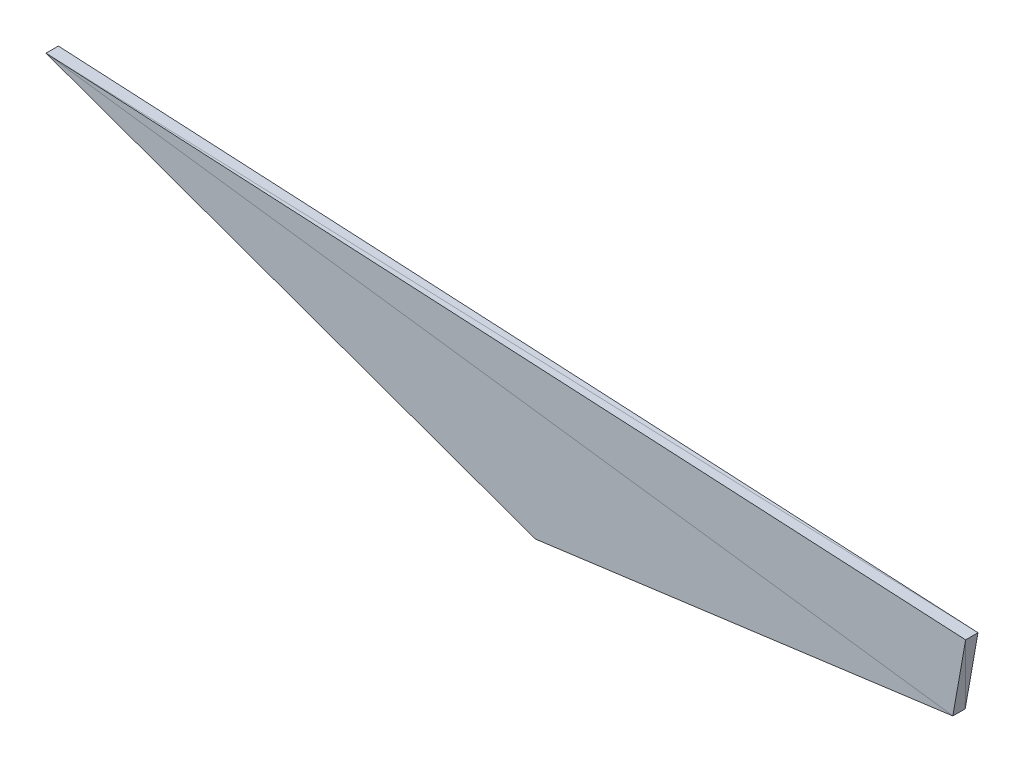
ISO-10303-21;
HEADER;
FILE_DESCRIPTION(('STEP AP214'),'2;1');
FILE_NAME('part.step','',(''),(''),'','','');
FILE_SCHEMA(('AUTOMOTIVE_DESIGN { 1 0 10303 214 1 1 1 1 }'));
ENDSEC;
DATA;
#1=APPLICATION_CONTEXT('core data for automotive mechanical design processes');
#2=APPLICATION_PROTOCOL_DEFINITION('international standard','automotive_design',2000,#1);
#3=PRODUCT_CONTEXT('',#1,'mechanical');
#4=PRODUCT('Part','Part','',(#3));
#5=PRODUCT_RELATED_PRODUCT_CATEGORY('part','',(#4));
#6=PRODUCT_DEFINITION_FORMATION('','',#4);
#7=PRODUCT_DEFINITION_CONTEXT('part definition',#1,'design');
#8=PRODUCT_DEFINITION('design','',#6,#7);
#9=PRODUCT_DEFINITION_SHAPE('','',#8);
#10=(LENGTH_UNIT() NAMED_UNIT(*) SI_UNIT(.MILLI.,.METRE.));
#11=(NAMED_UNIT(*) PLANE_ANGLE_UNIT() SI_UNIT($,.RADIAN.));
#12=(NAMED_UNIT(*) SI_UNIT($,.STERADIAN.) SOLID_ANGLE_UNIT());
#13=UNCERTAINTY_MEASURE_WITH_UNIT(LENGTH_MEASURE(1.E-05),#10,'distance_accuracy_value','');
#14=(GEOMETRIC_REPRESENTATION_CONTEXT(3) GLOBAL_UNCERTAINTY_ASSIGNED_CONTEXT((#13)) GLOBAL_UNIT_ASSIGNED_CONTEXT((#10,
#11,#12)) REPRESENTATION_CONTEXT('',''));
#15=CARTESIAN_POINT('',(0.,0.,0.));
#16=DIRECTION('',(0.,0.,1.));
#17=DIRECTION('',(1.,0.,0.));
#18=AXIS2_PLACEMENT_3D('',#15,#16,#17);
#19=CARTESIAN_POINT('',(-1.68173017738298E-07,-1.26453930597937E-06,1.19982058217391));
#20=DIRECTION('',(-1.40165138218829E-07,-1.05394033471862E-06,0.999999999999435));
#21=DIRECTION('',(0.,-0.999999999999445,-1.05394033471863E-06));
#22=AXIS2_PLACEMENT_3D('',#19,#20,#21);
#23=PLANE('',#22);
#24=DIRECTION('',(-0.991272231629246,0.131830811272533,0.));
#25=VECTOR('',#24,1.);
#26=CARTESIAN_POINT('',(149.287655949593,154.743194580078,1.20000459719449));
#27=LINE('',#26,#25);
#28=CARTESIAN_POINT('',(149.287655949593,154.743194580078,1.20000459719449));
#29=VERTEX_POINT('',#28);
#30=CARTESIAN_POINT('',(61.3317042589188,166.440591216087,1.20000459719449));
#31=VERTEX_POINT('',#30);
#32=EDGE_CURVE('E19',#29,#31,#27,.T.);
#33=ORIENTED_EDGE('',*,*,#32,.F.);
#34=DIRECTION('',(-0.174115871994138,-0.984725171364373,-1.06224655197836E-06));
#35=VECTOR('',#34,1.);
#36=CARTESIAN_POINT('',(150.527983903885,161.757960915565,1.20001216419041));
#37=LINE('',#36,#35);
#38=CARTESIAN_POINT('',(150.527983903885,161.757960915565,1.20001216419041));
#39=VERTEX_POINT('',#38);
#40=EDGE_CURVE('E61',#39,#29,#37,.T.);
#41=ORIENTED_EDGE('',*,*,#40,.F.);
#42=DIRECTION('',(0.998624819529042,-0.0524258506901051,8.47186672338518E-08));
#43=VECTOR('',#42,1.);
#44=CARTESIAN_POINT('',(61.3317042589188,166.440591216087,1.20000459719449));
#45=LINE('',#44,#43);
#46=EDGE_CURVE('E64',#31,#39,#45,.T.);
#47=ORIENTED_EDGE('',*,*,#46,.F.);
#48=EDGE_LOOP('',(#33,#41,#47));
#49=FACE_BOUND('',#48,.T.);
#50=ADVANCED_FACE('F16',(#49),#23,.T.);
#51=CARTESIAN_POINT('',(0.,0.,1.20000459719449));
#52=DIRECTION('',(0.,0.,1.));
#53=DIRECTION('',(1.,0.,0.));
#54=AXIS2_PLACEMENT_3D('',#51,#52,#53);
#55=PLANE('',#54);
#56=DIRECTION('',(-0.94097185144965,0.338484822081312,0.));
#57=VECTOR('',#56,1.);
#58=CARTESIAN_POINT('',(108.808726072311,149.362236261368,1.20000459719449));
#59=LINE('',#58,#57);
#60=CARTESIAN_POINT('',(108.808726072311,149.362236261368,1.20000459719449));
#61=VERTEX_POINT('',#60);
#62=EDGE_CURVE('E71',#61,#31,#59,.T.);
#63=ORIENTED_EDGE('',*,*,#62,.F.);
#64=DIRECTION('',(-0.991279899297255,-0.131773143125694,0.));
#65=VECTOR('',#64,1.);
#66=CARTESIAN_POINT('',(149.287655949593,154.743194580078,1.20000459719449));
#67=LINE('',#66,#65);
#68=EDGE_CURVE('E68',#29,#61,#67,.T.);
#69=ORIENTED_EDGE('',*,*,#68,.F.);
#70=ORIENTED_EDGE('',*,*,#32,.T.);
#71=EDGE_LOOP('',(#63,#69,#70));
#72=FACE_BOUND('',#71,.T.);
#73=ADVANCED_FACE('F69',(#72),#55,.T.);
#74=CARTESIAN_POINT('',(118.230108289755,-20.9050596038991,0.));
#75=DIRECTION('',(-0.984725171364928,0.174115871994236,0.));
#76=DIRECTION('',(-0.174115871994236,-0.984725171364928,0.));
#77=AXIS2_PLACEMENT_3D('',#74,#75,#76);
#78=PLANE('',#77);
#79=DIRECTION('',(-0.171696777417517,-0.971043803352217,-0.166114865667409));
#80=VECTOR('',#79,1.);
#81=CARTESIAN_POINT('',(150.527983903885,161.757960915565,1.20001216419041));
#82=LINE('',#81,#80);
#83=CARTESIAN_POINT('',(149.287655949593,154.743194580078,7.62939489357259E-06));
#84=VERTEX_POINT('',#83);
#85=EDGE_CURVE('E55',#39,#84,#82,.T.);
#86=ORIENTED_EDGE('',*,*,#85,.F.);
#87=ORIENTED_EDGE('',*,*,#40,.T.);
#88=DIRECTION('',(0.,0.,1.));
#89=VECTOR('',#88,1.);
#90=CARTESIAN_POINT('',(149.287655949593,154.743194580078,7.6293948936268E-06));
#91=LINE('',#90,#89);
#92=EDGE_CURVE('E76',#84,#29,#91,.T.);
#93=ORIENTED_EDGE('',*,*,#92,.F.);
#94=EDGE_LOOP('',(#86,#87,#93));
#95=FACE_BOUND('',#94,.T.);
#96=ADVANCED_FACE('F78',(#95),#78,.F.);
#97=CARTESIAN_POINT('',(-17.6209306483223,132.555647867725,0.));
#98=DIRECTION('',(-0.131773143125694,0.991279899297255,0.));
#99=DIRECTION('',(-0.991279899297255,-0.131773143125694,0.));
#100=AXIS2_PLACEMENT_3D('',#97,#98,#99);
#101=PLANE('',#100);
#102=DIRECTION('',(-0.990852159178207,-0.131716282636575,-0.0293737900225191));
#103=VECTOR('',#102,1.);
#104=CARTESIAN_POINT('',(149.287655949593,154.743194580078,1.20000459719449));
#105=LINE('',#104,#103);
#106=CARTESIAN_POINT('',(108.808726072311,149.362236261368,7.6293948936268E-06));
#107=VERTEX_POINT('',#106);
#108=EDGE_CURVE('E81',#29,#107,#105,.T.);
#109=ORIENTED_EDGE('',*,*,#108,.F.);
#110=ORIENTED_EDGE('',*,*,#68,.T.);
#111=DIRECTION('',(0.,0.,1.));
#112=VECTOR('',#111,1.);
#113=CARTESIAN_POINT('',(108.808726072311,149.362236261368,7.6293948936268E-06));
#114=LINE('',#113,#112);
#115=EDGE_CURVE('E25',#107,#61,#114,.T.);
#116=ORIENTED_EDGE('',*,*,#115,.F.);
#117=EDGE_LOOP('',(#109,#110,#116));
#118=FACE_BOUND('',#117,.T.);
#119=ADVANCED_FACE('F82',(#118),#101,.F.);
#120=CARTESIAN_POINT('',(-17.6209306483223,132.555647867725,0.));
#121=DIRECTION('',(0.131773143125694,-0.991279899297255,0.));
#122=DIRECTION('',(0.991279899297255,0.131773143125694,0.));
#123=AXIS2_PLACEMENT_3D('',#120,#121,#122);
#124=PLANE('',#123);
#125=DIRECTION('',(-0.991279899297255,-0.131773143125694,0.));
#126=VECTOR('',#125,1.);
#127=CARTESIAN_POINT('',(149.287655949593,154.743194580078,7.6293948936268E-06));
#128=LINE('',#127,#126);
#129=EDGE_CURVE('E88',#84,#107,#128,.T.);
#130=ORIENTED_EDGE('',*,*,#129,.F.);
#131=ORIENTED_EDGE('',*,*,#92,.T.);
#132=ORIENTED_EDGE('',*,*,#108,.T.);
#133=EDGE_LOOP('',(#130,#131,#132));
#134=FACE_BOUND('',#133,.T.);
#135=ADVANCED_FACE('F87',(#134),#124,.T.);
#136=CARTESIAN_POINT('',(118.230108289755,-20.9050596038991,0.));
#137=DIRECTION('',(0.984725171364928,-0.174115871994236,0.));
#138=DIRECTION('',(0.174115871994236,0.984725171364928,0.));
#139=AXIS2_PLACEMENT_3D('',#136,#137,#138);
#140=PLANE('',#139);
#141=DIRECTION('',(-0.174115871994136,-0.984725171364363,1.07100605133857E-06));
#142=VECTOR('',#141,1.);
#143=CARTESIAN_POINT('',(150.527983903885,161.757960915565,0.));
#144=LINE('',#143,#142);
#145=CARTESIAN_POINT('',(150.527983903885,161.757960915565,0.));
#146=VERTEX_POINT('',#145);
#147=EDGE_CURVE('E94',#146,#84,#144,.T.);
#148=ORIENTED_EDGE('',*,*,#147,.F.);
#149=DIRECTION('',(0.,0.,-1.));
#150=VECTOR('',#149,1.);
#151=CARTESIAN_POINT('',(150.527983903885,161.757960915565,1.20001216419041));
#152=LINE('',#151,#150);
#153=EDGE_CURVE('E92',#39,#146,#152,.T.);
#154=ORIENTED_EDGE('',*,*,#153,.F.);
#155=ORIENTED_EDGE('',*,*,#85,.T.);
#156=EDGE_LOOP('',(#148,#154,#155));
#157=FACE_BOUND('',#156,.T.);
#158=ADVANCED_FACE('F124',(#157),#140,.T.);
#159=CARTESIAN_POINT('',(8.88235838663851,169.194079334669,0.));
#160=DIRECTION('',(-0.0524258506901053,-0.998624819529046,0.));
#161=DIRECTION('',(0.998624819529046,-0.0524258506901053,0.));
#162=AXIS2_PLACEMENT_3D('',#159,#160,#161);
#163=PLANE('',#162);
#164=DIRECTION('',(0.998534705870427,-0.0524211198992022,-0.0134338140813969));
#165=VECTOR('',#164,1.);
#166=CARTESIAN_POINT('',(61.3317042589188,166.440591216087,1.20000459719449));
#167=LINE('',#166,#165);
#168=EDGE_CURVE('E98',#31,#146,#167,.T.);
#169=ORIENTED_EDGE('',*,*,#168,.F.);
#170=ORIENTED_EDGE('',*,*,#46,.T.);
#171=ORIENTED_EDGE('',*,*,#153,.T.);
#172=EDGE_LOOP('',(#169,#170,#171));
#173=FACE_BOUND('',#172,.T.);
#174=ADVANCED_FACE('F126',(#173),#163,.F.);
#175=CARTESIAN_POINT('',(2.72978181237425E-11,2.05259823776639E-10,0.000193161839086028));
#176=DIRECTION('',(1.41320968224833E-07,1.06263133933564E-06,0.999999999999425));
#177=DIRECTION('',(0.,-0.999999999999436,1.06263133933565E-06));
#178=AXIS2_PLACEMENT_3D('',#175,#176,#177);
#179=PLANE('',#178);
#180=DIRECTION('',(0.991272231629246,-0.131830811272533,0.));
#181=VECTOR('',#180,1.);
#182=CARTESIAN_POINT('',(61.3317042589188,166.440591216087,7.6293948936268E-06));
#183=LINE('',#182,#181);
#184=CARTESIAN_POINT('',(61.3317042589188,166.440591216087,7.6293948936268E-06));
#185=VERTEX_POINT('',#184);
#186=EDGE_CURVE('E34',#185,#84,#183,.T.);
#187=ORIENTED_EDGE('',*,*,#186,.F.);
#188=DIRECTION('',(-0.998624819529042,0.0524258506901051,8.54172744546059E-08));
#189=VECTOR('',#188,1.);
#190=CARTESIAN_POINT('',(150.527983903885,161.757960915565,0.));
#191=LINE('',#190,#189);
#192=EDGE_CURVE('E101',#146,#185,#191,.T.);
#193=ORIENTED_EDGE('',*,*,#192,.F.);
#194=ORIENTED_EDGE('',*,*,#147,.T.);
#195=EDGE_LOOP('',(#187,#193,#194));
#196=FACE_BOUND('',#195,.T.);
#197=ADVANCED_FACE('F122',(#196),#179,.F.);
#198=CARTESIAN_POINT('',(8.88235838663851,169.194079334669,0.));
#199=DIRECTION('',(0.0524258506901053,0.998624819529046,0.));
#200=DIRECTION('',(-0.998624819529046,0.0524258506901053,0.));
#201=AXIS2_PLACEMENT_3D('',#198,#199,#200);
#202=PLANE('',#201);
#203=ORIENTED_EDGE('',*,*,#192,.T.);
#204=DIRECTION('',(0.,0.,-1.));
#205=VECTOR('',#204,1.);
#206=CARTESIAN_POINT('',(61.3317042589188,166.440591216087,1.20000459719449));
#207=LINE('',#206,#205);
#208=EDGE_CURVE('E105',#31,#185,#207,.T.);
#209=ORIENTED_EDGE('',*,*,#208,.F.);
#210=ORIENTED_EDGE('',*,*,#168,.T.);
#211=EDGE_LOOP('',(#203,#209,#210));
#212=FACE_BOUND('',#211,.T.);
#213=ADVANCED_FACE('F121',(#212),#202,.T.);
#214=CARTESIAN_POINT('',(0.,0.,7.6293948936268E-06));
#215=DIRECTION('',(0.,0.,-1.));
#216=DIRECTION('',(-1.,0.,0.));
#217=AXIS2_PLACEMENT_3D('',#214,#215,#216);
#218=PLANE('',#217);
#219=ORIENTED_EDGE('',*,*,#129,.T.);
#220=DIRECTION('',(0.94097185144965,-0.338484822081312,0.));
#221=VECTOR('',#220,1.);
#222=CARTESIAN_POINT('',(61.3317042589188,166.440591216087,7.6293948936268E-06));
#223=LINE('',#222,#221);
#224=EDGE_CURVE('E107',#185,#107,#223,.T.);
#225=ORIENTED_EDGE('',*,*,#224,.F.);
#226=ORIENTED_EDGE('',*,*,#186,.T.);
#227=EDGE_LOOP('',(#219,#225,#226));
#228=FACE_BOUND('',#227,.T.);
#229=ADVANCED_FACE('F116',(#228),#218,.T.);
#230=CARTESIAN_POINT('',(60.0390033358673,166.905599432082,0.));
#231=DIRECTION('',(0.338484822081312,0.94097185144965,0.));
#232=DIRECTION('',(-0.94097185144965,0.338484822081312,0.));
#233=AXIS2_PLACEMENT_3D('',#230,#231,#232);
#234=PLANE('',#233);
#235=DIRECTION('',(-0.940705834649394,0.338389130962426,-0.0237766419639286));
#236=VECTOR('',#235,1.);
#237=CARTESIAN_POINT('',(108.808726072311,149.362236261368,1.20000459719449));
#238=LINE('',#237,#236);
#239=EDGE_CURVE('E10',#61,#185,#238,.T.);
#240=ORIENTED_EDGE('',*,*,#239,.F.);
#241=ORIENTED_EDGE('',*,*,#62,.T.);
#242=ORIENTED_EDGE('',*,*,#208,.T.);
#243=EDGE_LOOP('',(#240,#241,#242));
#244=FACE_BOUND('',#243,.T.);
#245=ADVANCED_FACE('F119',(#244),#234,.F.);
#246=CARTESIAN_POINT('',(60.0390033358673,166.905599432082,0.));
#247=DIRECTION('',(-0.338484822081312,-0.94097185144965,0.));
#248=DIRECTION('',(0.94097185144965,-0.338484822081312,0.));
#249=AXIS2_PLACEMENT_3D('',#246,#247,#248);
#250=PLANE('',#249);
#251=ORIENTED_EDGE('',*,*,#224,.T.);
#252=ORIENTED_EDGE('',*,*,#115,.T.);
#253=ORIENTED_EDGE('',*,*,#239,.T.);
#254=EDGE_LOOP('',(#251,#252,#253));
#255=FACE_BOUND('',#254,.T.);
#256=ADVANCED_FACE('F113',(#255),#250,.T.);
#257=CLOSED_SHELL('',(#50,#73,#96,#119,#135,#158,#174,#197,#213,#229,#245,#256));
#258=MANIFOLD_SOLID_BREP('B1',#257);
#259=ADVANCED_BREP_SHAPE_REPRESENTATION('',(#18,#258),#14);
#260=SHAPE_DEFINITION_REPRESENTATION(#9,#259);
ENDSEC;
END-ISO-10303-21;
